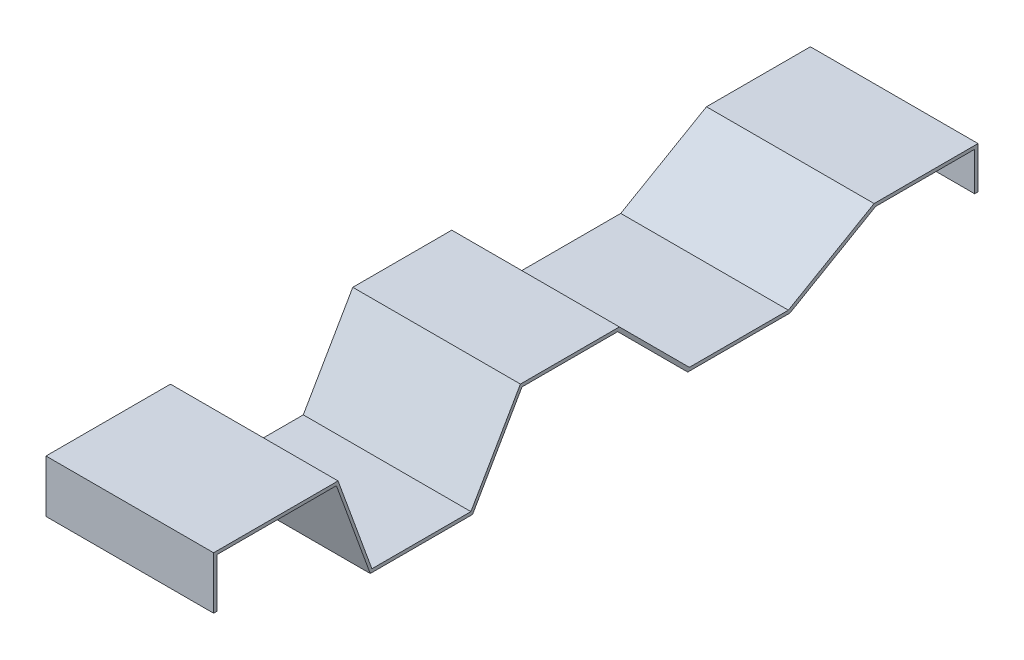
ISO-10303-21;
HEADER;
FILE_DESCRIPTION(('STEP AP214'),'2;1');
FILE_NAME('part.step','',(''),(''),'','','');
FILE_SCHEMA(('AUTOMOTIVE_DESIGN { 1 0 10303 214 1 1 1 1 }'));
ENDSEC;
DATA;
#1=APPLICATION_CONTEXT('core data for automotive mechanical design processes');
#2=APPLICATION_PROTOCOL_DEFINITION('international standard','automotive_design',2000,#1);
#3=PRODUCT_CONTEXT('',#1,'mechanical');
#4=PRODUCT('Part','Part','',(#3));
#5=PRODUCT_RELATED_PRODUCT_CATEGORY('part','',(#4));
#6=PRODUCT_DEFINITION_FORMATION('','',#4);
#7=PRODUCT_DEFINITION_CONTEXT('part definition',#1,'design');
#8=PRODUCT_DEFINITION('design','',#6,#7);
#9=PRODUCT_DEFINITION_SHAPE('','',#8);
#10=(LENGTH_UNIT() NAMED_UNIT(*) SI_UNIT(.MILLI.,.METRE.));
#11=(NAMED_UNIT(*) PLANE_ANGLE_UNIT() SI_UNIT($,.RADIAN.));
#12=(NAMED_UNIT(*) SI_UNIT($,.STERADIAN.) SOLID_ANGLE_UNIT());
#13=UNCERTAINTY_MEASURE_WITH_UNIT(LENGTH_MEASURE(1.E-05),#10,'distance_accuracy_value','');
#14=(GEOMETRIC_REPRESENTATION_CONTEXT(3) GLOBAL_UNCERTAINTY_ASSIGNED_CONTEXT((#13)) GLOBAL_UNIT_ASSIGNED_CONTEXT((#10,
#11,#12)) REPRESENTATION_CONTEXT('',''));
#15=CARTESIAN_POINT('',(0.,0.,0.));
#16=DIRECTION('',(0.,0.,1.));
#17=DIRECTION('',(1.,0.,0.));
#18=AXIS2_PLACEMENT_3D('',#15,#16,#17);
#19=CARTESIAN_POINT('',(101.6,-727.73801642509,-410.975974775369));
#20=DIRECTION('',(0.,1.,0.));
#21=DIRECTION('',(0.,0.,1.));
#22=AXIS2_PLACEMENT_3D('',#19,#20,#21);
#23=PLANE('',#22);
#24=DIRECTION('',(0.,0.,-1.));
#25=VECTOR('',#24,1.);
#26=CARTESIAN_POINT('',(0.,-727.73801642509,-410.975974775369));
#27=LINE('',#26,#25);
#28=CARTESIAN_POINT('',(0.,-727.73801642509,-408.975974775369));
#29=VERTEX_POINT('',#28);
#30=CARTESIAN_POINT('',(0.,-727.73801642509,-410.975974775369));
#31=VERTEX_POINT('',#30);
#32=EDGE_CURVE('E226',#29,#31,#27,.T.);
#33=ORIENTED_EDGE('',*,*,#32,.T.);
#34=DIRECTION('',(-1.,0.,0.));
#35=VECTOR('',#34,1.);
#36=CARTESIAN_POINT('',(101.6,-727.73801642509,-410.975974775369));
#37=LINE('',#36,#35);
#38=CARTESIAN_POINT('',(101.6,-727.73801642509,-410.975974775369));
#39=VERTEX_POINT('',#38);
#40=EDGE_CURVE('E11',#39,#31,#37,.T.);
#41=ORIENTED_EDGE('',*,*,#40,.F.);
#42=DIRECTION('',(0.,0.,-1.));
#43=VECTOR('',#42,1.);
#44=CARTESIAN_POINT('',(101.6,-727.73801642509,-410.975974775369));
#45=LINE('',#44,#43);
#46=CARTESIAN_POINT('',(101.6,-727.73801642509,-408.975974775369));
#47=VERTEX_POINT('',#46);
#48=EDGE_CURVE('E272',#47,#39,#45,.T.);
#49=ORIENTED_EDGE('',*,*,#48,.F.);
#50=DIRECTION('',(-1.,0.,0.));
#51=VECTOR('',#50,1.);
#52=CARTESIAN_POINT('',(101.6,-727.73801642509,-408.975974775369));
#53=LINE('',#52,#51);
#54=EDGE_CURVE('E222',#47,#29,#53,.T.);
#55=ORIENTED_EDGE('',*,*,#54,.T.);
#56=EDGE_LOOP('',(#33,#41,#49,#55));
#57=FACE_BOUND('',#56,.T.);
#58=ADVANCED_FACE('F34',(#57),#23,.F.);
#59=CARTESIAN_POINT('',(101.6,-727.73801642509,-410.975974775369));
#60=DIRECTION('',(0.,0.,1.));
#61=DIRECTION('',(0.,-1.,0.));
#62=AXIS2_PLACEMENT_3D('',#59,#60,#61);
#63=PLANE('',#62);
#64=DIRECTION('',(0.,1.,0.));
#65=VECTOR('',#64,1.);
#66=CARTESIAN_POINT('',(0.,-727.73801642509,-410.975974775369));
#67=LINE('',#66,#65);
#68=CARTESIAN_POINT('',(0.,-702.33801642509,-410.975974775369));
#69=VERTEX_POINT('',#68);
#70=EDGE_CURVE('E229',#31,#69,#67,.T.);
#71=ORIENTED_EDGE('',*,*,#70,.T.);
#72=DIRECTION('',(-1.,0.,0.));
#73=VECTOR('',#72,1.);
#74=CARTESIAN_POINT('',(101.6,-702.33801642509,-410.975974775369));
#75=LINE('',#74,#73);
#76=CARTESIAN_POINT('',(101.6,-702.33801642509,-410.975974775369));
#77=VERTEX_POINT('',#76);
#78=EDGE_CURVE('E42',#77,#69,#75,.T.);
#79=ORIENTED_EDGE('',*,*,#78,.F.);
#80=DIRECTION('',(0.,1.,0.));
#81=VECTOR('',#80,1.);
#82=CARTESIAN_POINT('',(101.6,-727.73801642509,-410.975974775369));
#83=LINE('',#82,#81);
#84=EDGE_CURVE('E141',#39,#77,#83,.T.);
#85=ORIENTED_EDGE('',*,*,#84,.F.);
#86=ORIENTED_EDGE('',*,*,#40,.T.);
#87=EDGE_LOOP('',(#71,#79,#85,#86));
#88=FACE_BOUND('',#87,.T.);
#89=ADVANCED_FACE('F410',(#88),#63,.F.);
#90=CARTESIAN_POINT('',(101.6,-702.33801642509,-410.975974775369));
#91=DIRECTION('',(0.,-1.,0.));
#92=DIRECTION('',(0.,0.,-1.));
#93=AXIS2_PLACEMENT_3D('',#90,#91,#92);
#94=PLANE('',#93);
#95=DIRECTION('',(0.,0.,1.));
#96=VECTOR('',#95,1.);
#97=CARTESIAN_POINT('',(0.,-702.33801642509,-410.975974775369));
#98=LINE('',#97,#96);
#99=CARTESIAN_POINT('',(0.,-702.33801642509,-347.983974775369));
#100=VERTEX_POINT('',#99);
#101=EDGE_CURVE('E231',#69,#100,#98,.T.);
#102=ORIENTED_EDGE('',*,*,#101,.T.);
#103=DIRECTION('',(-1.,0.,0.));
#104=VECTOR('',#103,1.);
#105=CARTESIAN_POINT('',(101.6,-702.33801642509,-347.983974775369));
#106=LINE('',#105,#104);
#107=CARTESIAN_POINT('',(101.6,-702.33801642509,-347.983974775369));
#108=VERTEX_POINT('',#107);
#109=EDGE_CURVE('E327',#108,#100,#106,.T.);
#110=ORIENTED_EDGE('',*,*,#109,.F.);
#111=DIRECTION('',(0.,0.,1.));
#112=VECTOR('',#111,1.);
#113=CARTESIAN_POINT('',(101.6,-702.33801642509,-410.975974775369));
#114=LINE('',#113,#112);
#115=EDGE_CURVE('E335',#77,#108,#114,.T.);
#116=ORIENTED_EDGE('',*,*,#115,.F.);
#117=ORIENTED_EDGE('',*,*,#78,.T.);
#118=EDGE_LOOP('',(#102,#110,#116,#117));
#119=FACE_BOUND('',#118,.T.);
#120=ADVANCED_FACE('F333',(#119),#94,.F.);
#121=CARTESIAN_POINT('',(101.6,-702.33801642509,-347.983974775369));
#122=DIRECTION('',(0.,-0.86602540378444,-0.499999999999997));
#123=DIRECTION('',(0.,0.499999999999997,-0.86602540378444));
#124=AXIS2_PLACEMENT_3D('',#121,#122,#123);
#125=PLANE('',#124);
#126=DIRECTION('',(0.,-0.499999999999997,0.86602540378444));
#127=VECTOR('',#126,1.);
#128=CARTESIAN_POINT('',(0.,-702.33801642509,-347.983974775369));
#129=LINE('',#128,#127);
#130=CARTESIAN_POINT('',(0.,-732.33801642509,-296.022450548302));
#131=VERTEX_POINT('',#130);
#132=EDGE_CURVE('E233',#100,#131,#129,.T.);
#133=ORIENTED_EDGE('',*,*,#132,.T.);
#134=DIRECTION('',(-1.,0.,0.));
#135=VECTOR('',#134,1.);
#136=CARTESIAN_POINT('',(101.6,-732.33801642509,-296.022450548302));
#137=LINE('',#136,#135);
#138=CARTESIAN_POINT('',(101.6,-732.33801642509,-296.022450548302));
#139=VERTEX_POINT('',#138);
#140=EDGE_CURVE('E324',#139,#131,#137,.T.);
#141=ORIENTED_EDGE('',*,*,#140,.F.);
#142=DIRECTION('',(0.,-0.499999999999997,0.86602540378444));
#143=VECTOR('',#142,1.);
#144=CARTESIAN_POINT('',(101.6,-702.33801642509,-347.983974775369));
#145=LINE('',#144,#143);
#146=EDGE_CURVE('E353',#108,#139,#145,.T.);
#147=ORIENTED_EDGE('',*,*,#146,.F.);
#148=ORIENTED_EDGE('',*,*,#109,.T.);
#149=EDGE_LOOP('',(#133,#141,#147,#148));
#150=FACE_BOUND('',#149,.T.);
#151=ADVANCED_FACE('F344',(#150),#125,.F.);
#152=CARTESIAN_POINT('',(101.6,-732.33801642509,-296.022450548302));
#153=DIRECTION('',(0.,-1.,0.));
#154=DIRECTION('',(0.,0.,-1.));
#155=AXIS2_PLACEMENT_3D('',#152,#153,#154);
#156=PLANE('',#155);
#157=DIRECTION('',(0.,0.,1.));
#158=VECTOR('',#157,1.);
#159=CARTESIAN_POINT('',(0.,-732.33801642509,-296.022450548302));
#160=LINE('',#159,#158);
#161=CARTESIAN_POINT('',(0.,-732.33801642509,-236.022450548302));
#162=VERTEX_POINT('',#161);
#163=EDGE_CURVE('E235',#131,#162,#160,.T.);
#164=ORIENTED_EDGE('',*,*,#163,.T.);
#165=DIRECTION('',(-1.,0.,0.));
#166=VECTOR('',#165,1.);
#167=CARTESIAN_POINT('',(101.6,-732.33801642509,-236.022450548302));
#168=LINE('',#167,#166);
#169=CARTESIAN_POINT('',(101.6,-732.33801642509,-236.022450548302));
#170=VERTEX_POINT('',#169);
#171=EDGE_CURVE('E321',#170,#162,#168,.T.);
#172=ORIENTED_EDGE('',*,*,#171,.F.);
#173=DIRECTION('',(0.,0.,1.));
#174=VECTOR('',#173,1.);
#175=CARTESIAN_POINT('',(101.6,-732.33801642509,-296.022450548302));
#176=LINE('',#175,#174);
#177=EDGE_CURVE('E350',#139,#170,#176,.T.);
#178=ORIENTED_EDGE('',*,*,#177,.F.);
#179=ORIENTED_EDGE('',*,*,#140,.T.);
#180=EDGE_LOOP('',(#164,#172,#178,#179));
#181=FACE_BOUND('',#180,.T.);
#182=ADVANCED_FACE('F348',(#181),#156,.F.);
#183=CARTESIAN_POINT('',(101.6,-732.33801642509,-236.022450548302));
#184=DIRECTION('',(0.,-0.707106781186546,0.707106781186549));
#185=DIRECTION('',(0.,-0.707106781186549,-0.707106781186546));
#186=AXIS2_PLACEMENT_3D('',#183,#184,#185);
#187=PLANE('',#186);
#188=DIRECTION('',(0.,0.707106781186549,0.707106781186546));
#189=VECTOR('',#188,1.);
#190=CARTESIAN_POINT('',(0.,-732.33801642509,-236.022450548302));
#191=LINE('',#190,#189);
#192=CARTESIAN_POINT('',(0.,-689.911609553897,-193.59604367711));
#193=VERTEX_POINT('',#192);
#194=EDGE_CURVE('E237',#162,#193,#191,.T.);
#195=ORIENTED_EDGE('',*,*,#194,.T.);
#196=DIRECTION('',(-1.,0.,0.));
#197=VECTOR('',#196,1.);
#198=CARTESIAN_POINT('',(101.6,-689.911609553897,-193.59604367711));
#199=LINE('',#198,#197);
#200=CARTESIAN_POINT('',(101.6,-689.911609553897,-193.59604367711));
#201=VERTEX_POINT('',#200);
#202=EDGE_CURVE('E318',#201,#193,#199,.T.);
#203=ORIENTED_EDGE('',*,*,#202,.F.);
#204=DIRECTION('',(0.,0.707106781186549,0.707106781186546));
#205=VECTOR('',#204,1.);
#206=CARTESIAN_POINT('',(101.6,-732.33801642509,-236.022450548302));
#207=LINE('',#206,#205);
#208=EDGE_CURVE('E352',#170,#201,#207,.T.);
#209=ORIENTED_EDGE('',*,*,#208,.F.);
#210=ORIENTED_EDGE('',*,*,#171,.T.);
#211=EDGE_LOOP('',(#195,#203,#209,#210));
#212=FACE_BOUND('',#211,.T.);
#213=ADVANCED_FACE('F423',(#212),#187,.F.);
#214=CARTESIAN_POINT('',(101.6,-689.911609553897,-193.59604367711));
#215=DIRECTION('',(0.,-1.,0.));
#216=DIRECTION('',(0.,0.,-1.));
#217=AXIS2_PLACEMENT_3D('',#214,#215,#216);
#218=PLANE('',#217);
#219=DIRECTION('',(0.,0.,1.));
#220=VECTOR('',#219,1.);
#221=CARTESIAN_POINT('',(0.,-689.911609553897,-193.59604367711));
#222=LINE('',#221,#220);
#223=CARTESIAN_POINT('',(0.,-689.911609553897,-133.59604367711));
#224=VERTEX_POINT('',#223);
#225=EDGE_CURVE('E239',#193,#224,#222,.T.);
#226=ORIENTED_EDGE('',*,*,#225,.T.);
#227=DIRECTION('',(-1.,0.,0.));
#228=VECTOR('',#227,1.);
#229=CARTESIAN_POINT('',(101.6,-689.911609553897,-133.59604367711));
#230=LINE('',#229,#228);
#231=CARTESIAN_POINT('',(101.6,-689.911609553897,-133.59604367711));
#232=VERTEX_POINT('',#231);
#233=EDGE_CURVE('E315',#232,#224,#230,.T.);
#234=ORIENTED_EDGE('',*,*,#233,.F.);
#235=DIRECTION('',(0.,0.,1.));
#236=VECTOR('',#235,1.);
#237=CARTESIAN_POINT('',(101.6,-689.911609553897,-193.59604367711));
#238=LINE('',#237,#236);
#239=EDGE_CURVE('E355',#201,#232,#238,.T.);
#240=ORIENTED_EDGE('',*,*,#239,.F.);
#241=ORIENTED_EDGE('',*,*,#202,.T.);
#242=EDGE_LOOP('',(#226,#234,#240,#241));
#243=FACE_BOUND('',#242,.T.);
#244=ADVANCED_FACE('F426',(#243),#218,.F.);
#245=CARTESIAN_POINT('',(101.6,-689.911609553897,-133.59604367711));
#246=DIRECTION('',(0.,-0.499999999999994,-0.866025403784442));
#247=DIRECTION('',(0.,0.866025403784442,-0.499999999999994));
#248=AXIS2_PLACEMENT_3D('',#245,#246,#247);
#249=PLANE('',#248);
#250=DIRECTION('',(0.,-0.866025403784442,0.499999999999994));
#251=VECTOR('',#250,1.);
#252=CARTESIAN_POINT('',(0.,-689.911609553897,-133.59604367711));
#253=LINE('',#252,#251);
#254=CARTESIAN_POINT('',(0.,-741.873133780964,-103.59604367711));
#255=VERTEX_POINT('',#254);
#256=EDGE_CURVE('E241',#224,#255,#253,.T.);
#257=ORIENTED_EDGE('',*,*,#256,.T.);
#258=DIRECTION('',(-1.,0.,0.));
#259=VECTOR('',#258,1.);
#260=CARTESIAN_POINT('',(101.6,-741.873133780964,-103.59604367711));
#261=LINE('',#260,#259);
#262=CARTESIAN_POINT('',(101.6,-741.873133780964,-103.59604367711));
#263=VERTEX_POINT('',#262);
#264=EDGE_CURVE('E312',#263,#255,#261,.T.);
#265=ORIENTED_EDGE('',*,*,#264,.F.);
#266=DIRECTION('',(0.,-0.866025403784442,0.499999999999994));
#267=VECTOR('',#266,1.);
#268=CARTESIAN_POINT('',(101.6,-689.911609553897,-133.59604367711));
#269=LINE('',#268,#267);
#270=EDGE_CURVE('E361',#232,#263,#269,.T.);
#271=ORIENTED_EDGE('',*,*,#270,.F.);
#272=ORIENTED_EDGE('',*,*,#233,.T.);
#273=EDGE_LOOP('',(#257,#265,#271,#272));
#274=FACE_BOUND('',#273,.T.);
#275=ADVANCED_FACE('F430',(#274),#249,.F.);
#276=CARTESIAN_POINT('',(101.6,-741.873133780964,-103.59604367711));
#277=DIRECTION('',(0.,-1.,0.));
#278=DIRECTION('',(0.,0.,-1.));
#279=AXIS2_PLACEMENT_3D('',#276,#277,#278);
#280=PLANE('',#279);
#281=DIRECTION('',(0.,0.,1.));
#282=VECTOR('',#281,1.);
#283=CARTESIAN_POINT('',(0.,-741.873133780964,-103.59604367711));
#284=LINE('',#283,#282);
#285=CARTESIAN_POINT('',(0.,-741.873133780964,-43.5960436771099));
#286=VERTEX_POINT('',#285);
#287=EDGE_CURVE('E243',#255,#286,#284,.T.);
#288=ORIENTED_EDGE('',*,*,#287,.T.);
#289=DIRECTION('',(-1.,0.,0.));
#290=VECTOR('',#289,1.);
#291=CARTESIAN_POINT('',(101.6,-741.873133780964,-43.5960436771099));
#292=LINE('',#291,#290);
#293=CARTESIAN_POINT('',(101.6,-741.873133780964,-43.5960436771099));
#294=VERTEX_POINT('',#293);
#295=EDGE_CURVE('E309',#294,#286,#292,.T.);
#296=ORIENTED_EDGE('',*,*,#295,.F.);
#297=DIRECTION('',(0.,0.,1.));
#298=VECTOR('',#297,1.);
#299=CARTESIAN_POINT('',(101.6,-741.873133780964,-103.59604367711));
#300=LINE('',#299,#298);
#301=EDGE_CURVE('E363',#263,#294,#300,.T.);
#302=ORIENTED_EDGE('',*,*,#301,.F.);
#303=ORIENTED_EDGE('',*,*,#264,.T.);
#304=EDGE_LOOP('',(#288,#296,#302,#303));
#305=FACE_BOUND('',#304,.T.);
#306=ADVANCED_FACE('F434',(#305),#280,.F.);
#307=CARTESIAN_POINT('',(101.6,-741.873133780964,-43.5960436771099));
#308=DIRECTION('',(0.,-0.342020143325665,0.93969262078591));
#309=DIRECTION('',(0.,-0.93969262078591,-0.342020143325665));
#310=AXIS2_PLACEMENT_3D('',#307,#308,#309);
#311=PLANE('',#310);
#312=DIRECTION('',(0.,0.93969262078591,0.342020143325665));
#313=VECTOR('',#312,1.);
#314=CARTESIAN_POINT('',(0.,-741.873133780964,-43.5960436771099));
#315=LINE('',#314,#313);
#316=CARTESIAN_POINT('',(0.,-685.491576533809,-23.07483507757));
#317=VERTEX_POINT('',#316);
#318=EDGE_CURVE('E245',#286,#317,#315,.T.);
#319=ORIENTED_EDGE('',*,*,#318,.T.);
#320=DIRECTION('',(-1.,0.,0.));
#321=VECTOR('',#320,1.);
#322=CARTESIAN_POINT('',(101.6,-685.491576533809,-23.07483507757));
#323=LINE('',#322,#321);
#324=CARTESIAN_POINT('',(101.6,-685.491576533809,-23.07483507757));
#325=VERTEX_POINT('',#324);
#326=EDGE_CURVE('E306',#325,#317,#323,.T.);
#327=ORIENTED_EDGE('',*,*,#326,.F.);
#328=DIRECTION('',(0.,0.93969262078591,0.342020143325665));
#329=VECTOR('',#328,1.);
#330=CARTESIAN_POINT('',(101.6,-741.873133780964,-43.5960436771099));
#331=LINE('',#330,#329);
#332=EDGE_CURVE('E365',#294,#325,#331,.T.);
#333=ORIENTED_EDGE('',*,*,#332,.F.);
#334=ORIENTED_EDGE('',*,*,#295,.T.);
#335=EDGE_LOOP('',(#319,#327,#333,#334));
#336=FACE_BOUND('',#335,.T.);
#337=ADVANCED_FACE('F438',(#336),#311,.F.);
#338=CARTESIAN_POINT('',(101.6,-685.491576533809,-23.07483507757));
#339=DIRECTION('',(0.,-1.,0.));
#340=DIRECTION('',(0.,0.,-1.));
#341=AXIS2_PLACEMENT_3D('',#338,#339,#340);
#342=PLANE('',#341);
#343=DIRECTION('',(0.,0.,1.));
#344=VECTOR('',#343,1.);
#345=CARTESIAN_POINT('',(0.,-685.491576533809,-23.07483507757));
#346=LINE('',#345,#344);
#347=CARTESIAN_POINT('',(0.,-685.491576533809,52.36316492243));
#348=VERTEX_POINT('',#347);
#349=EDGE_CURVE('E247',#317,#348,#346,.T.);
#350=ORIENTED_EDGE('',*,*,#349,.T.);
#351=DIRECTION('',(-1.,0.,0.));
#352=VECTOR('',#351,1.);
#353=CARTESIAN_POINT('',(101.6,-685.491576533809,52.36316492243));
#354=LINE('',#353,#352);
#355=CARTESIAN_POINT('',(101.6,-685.491576533809,52.36316492243));
#356=VERTEX_POINT('',#355);
#357=EDGE_CURVE('E303',#356,#348,#354,.T.);
#358=ORIENTED_EDGE('',*,*,#357,.F.);
#359=DIRECTION('',(0.,0.,1.));
#360=VECTOR('',#359,1.);
#361=CARTESIAN_POINT('',(101.6,-685.491576533809,-23.07483507757));
#362=LINE('',#361,#360);
#363=EDGE_CURVE('E367',#325,#356,#362,.T.);
#364=ORIENTED_EDGE('',*,*,#363,.F.);
#365=ORIENTED_EDGE('',*,*,#326,.T.);
#366=EDGE_LOOP('',(#350,#358,#364,#365));
#367=FACE_BOUND('',#366,.T.);
#368=ADVANCED_FACE('F442',(#367),#342,.F.);
#369=CARTESIAN_POINT('',(101.6,-685.491576533809,52.36316492243));
#370=DIRECTION('',(0.,0.,-1.));
#371=DIRECTION('',(0.,1.,0.));
#372=AXIS2_PLACEMENT_3D('',#369,#370,#371);
#373=PLANE('',#372);
#374=DIRECTION('',(0.,-1.,0.));
#375=VECTOR('',#374,1.);
#376=CARTESIAN_POINT('',(0.,-685.491576533809,52.36316492243));
#377=LINE('',#376,#375);
#378=CARTESIAN_POINT('',(0.,-717.241576533809,52.36316492243));
#379=VERTEX_POINT('',#378);
#380=EDGE_CURVE('E249',#348,#379,#377,.T.);
#381=ORIENTED_EDGE('',*,*,#380,.T.);
#382=DIRECTION('',(-1.,0.,0.));
#383=VECTOR('',#382,1.);
#384=CARTESIAN_POINT('',(101.6,-717.241576533809,52.36316492243));
#385=LINE('',#384,#383);
#386=CARTESIAN_POINT('',(101.6,-717.241576533809,52.36316492243));
#387=VERTEX_POINT('',#386);
#388=EDGE_CURVE('E300',#387,#379,#385,.T.);
#389=ORIENTED_EDGE('',*,*,#388,.F.);
#390=DIRECTION('',(0.,-1.,0.));
#391=VECTOR('',#390,1.);
#392=CARTESIAN_POINT('',(101.6,-685.491576533809,52.36316492243));
#393=LINE('',#392,#391);
#394=EDGE_CURVE('E369',#356,#387,#393,.T.);
#395=ORIENTED_EDGE('',*,*,#394,.F.);
#396=ORIENTED_EDGE('',*,*,#357,.T.);
#397=EDGE_LOOP('',(#381,#389,#395,#396));
#398=FACE_BOUND('',#397,.T.);
#399=ADVANCED_FACE('F446',(#398),#373,.F.);
#400=CARTESIAN_POINT('',(101.6,-717.241576533809,50.36316492243));
#401=DIRECTION('',(0.,1.,0.));
#402=DIRECTION('',(0.,0.,1.));
#403=AXIS2_PLACEMENT_3D('',#400,#401,#402);
#404=PLANE('',#403);
#405=DIRECTION('',(0.,0.,-1.));
#406=VECTOR('',#405,1.);
#407=CARTESIAN_POINT('',(0.,-717.241576533809,50.36316492243));
#408=LINE('',#407,#406);
#409=CARTESIAN_POINT('',(0.,-717.241576533809,50.36316492243));
#410=VERTEX_POINT('',#409);
#411=EDGE_CURVE('E251',#379,#410,#408,.T.);
#412=ORIENTED_EDGE('',*,*,#411,.T.);
#413=DIRECTION('',(-1.,0.,0.));
#414=VECTOR('',#413,1.);
#415=CARTESIAN_POINT('',(101.6,-717.241576533809,50.36316492243));
#416=LINE('',#415,#414);
#417=CARTESIAN_POINT('',(101.6,-717.241576533809,50.36316492243));
#418=VERTEX_POINT('',#417);
#419=EDGE_CURVE('E297',#418,#410,#416,.T.);
#420=ORIENTED_EDGE('',*,*,#419,.F.);
#421=DIRECTION('',(0.,0.,-1.));
#422=VECTOR('',#421,1.);
#423=CARTESIAN_POINT('',(101.6,-717.241576533809,50.36316492243));
#424=LINE('',#423,#422);
#425=EDGE_CURVE('E371',#387,#418,#424,.T.);
#426=ORIENTED_EDGE('',*,*,#425,.F.);
#427=ORIENTED_EDGE('',*,*,#388,.T.);
#428=EDGE_LOOP('',(#412,#420,#426,#427));
#429=FACE_BOUND('',#428,.T.);
#430=ADVANCED_FACE('F450',(#429),#404,.F.);
#431=CARTESIAN_POINT('',(101.6,-687.491576533809,50.3631649224301));
#432=DIRECTION('',(0.,0.,1.));
#433=DIRECTION('',(0.,-1.,0.));
#434=AXIS2_PLACEMENT_3D('',#431,#432,#433);
#435=PLANE('',#434);
#436=DIRECTION('',(0.,1.,0.));
#437=VECTOR('',#436,1.);
#438=CARTESIAN_POINT('',(0.,-687.491576533809,50.3631649224301));
#439=LINE('',#438,#437);
#440=CARTESIAN_POINT('',(0.,-687.491576533809,50.3631649224301));
#441=VERTEX_POINT('',#440);
#442=EDGE_CURVE('E253',#410,#441,#439,.T.);
#443=ORIENTED_EDGE('',*,*,#442,.T.);
#444=DIRECTION('',(-1.,0.,0.));
#445=VECTOR('',#444,1.);
#446=CARTESIAN_POINT('',(101.6,-687.491576533809,50.3631649224301));
#447=LINE('',#446,#445);
#448=CARTESIAN_POINT('',(101.6,-687.491576533809,50.3631649224301));
#449=VERTEX_POINT('',#448);
#450=EDGE_CURVE('E294',#449,#441,#447,.T.);
#451=ORIENTED_EDGE('',*,*,#450,.F.);
#452=DIRECTION('',(0.,1.,0.));
#453=VECTOR('',#452,1.);
#454=CARTESIAN_POINT('',(101.6,-687.491576533809,50.3631649224301));
#455=LINE('',#454,#453);
#456=EDGE_CURVE('E373',#418,#449,#455,.T.);
#457=ORIENTED_EDGE('',*,*,#456,.F.);
#458=ORIENTED_EDGE('',*,*,#419,.T.);
#459=EDGE_LOOP('',(#443,#451,#457,#458));
#460=FACE_BOUND('',#459,.T.);
#461=ADVANCED_FACE('F454',(#460),#435,.F.);
#462=CARTESIAN_POINT('',(101.6,-687.491576533809,-22.0668350775703));
#463=DIRECTION('',(0.,1.,0.));
#464=DIRECTION('',(0.,0.,1.));
#465=AXIS2_PLACEMENT_3D('',#462,#463,#464);
#466=PLANE('',#465);
#467=DIRECTION('',(0.,0.,-1.));
#468=VECTOR('',#467,1.);
#469=CARTESIAN_POINT('',(0.,-687.491576533809,-22.0668350775703));
#470=LINE('',#469,#468);
#471=CARTESIAN_POINT('',(0.,-687.491576533809,-22.0668350775703));
#472=VERTEX_POINT('',#471);
#473=EDGE_CURVE('E255',#441,#472,#470,.T.);
#474=ORIENTED_EDGE('',*,*,#473,.T.);
#475=DIRECTION('',(-1.,0.,0.));
#476=VECTOR('',#475,1.);
#477=CARTESIAN_POINT('',(101.6,-687.491576533809,-22.0668350775703));
#478=LINE('',#477,#476);
#479=CARTESIAN_POINT('',(101.6,-687.491576533809,-22.0668350775703));
#480=VERTEX_POINT('',#479);
#481=EDGE_CURVE('E291',#480,#472,#478,.T.);
#482=ORIENTED_EDGE('',*,*,#481,.F.);
#483=DIRECTION('',(0.,0.,-1.));
#484=VECTOR('',#483,1.);
#485=CARTESIAN_POINT('',(101.6,-687.491576533809,-22.0668350775703));
#486=LINE('',#485,#484);
#487=EDGE_CURVE('E375',#449,#480,#486,.T.);
#488=ORIENTED_EDGE('',*,*,#487,.F.);
#489=ORIENTED_EDGE('',*,*,#450,.T.);
#490=EDGE_LOOP('',(#474,#482,#488,#489));
#491=FACE_BOUND('',#490,.T.);
#492=ADVANCED_FACE('F458',(#491),#466,.F.);
#493=CARTESIAN_POINT('',(101.6,-743.873133780964,-42.5880436771102));
#494=DIRECTION('',(0.,0.342020143325667,-0.939692620785909));
#495=DIRECTION('',(0.,0.939692620785909,0.342020143325667));
#496=AXIS2_PLACEMENT_3D('',#493,#494,#495);
#497=PLANE('',#496);
#498=DIRECTION('',(0.,-0.939692620785909,-0.342020143325667));
#499=VECTOR('',#498,1.);
#500=CARTESIAN_POINT('',(0.,-743.873133780964,-42.5880436771102));
#501=LINE('',#500,#499);
#502=CARTESIAN_POINT('',(0.,-743.873133780964,-42.5880436771102));
#503=VERTEX_POINT('',#502);
#504=EDGE_CURVE('E257',#472,#503,#501,.T.);
#505=ORIENTED_EDGE('',*,*,#504,.T.);
#506=DIRECTION('',(-1.,0.,0.));
#507=VECTOR('',#506,1.);
#508=CARTESIAN_POINT('',(101.6,-743.873133780964,-42.5880436771102));
#509=LINE('',#508,#507);
#510=CARTESIAN_POINT('',(101.6,-743.873133780964,-42.5880436771102));
#511=VERTEX_POINT('',#510);
#512=EDGE_CURVE('E288',#511,#503,#509,.T.);
#513=ORIENTED_EDGE('',*,*,#512,.F.);
#514=DIRECTION('',(0.,-0.939692620785909,-0.342020143325667));
#515=VECTOR('',#514,1.);
#516=CARTESIAN_POINT('',(101.6,-743.873133780964,-42.5880436771102));
#517=LINE('',#516,#515);
#518=EDGE_CURVE('E377',#480,#511,#517,.T.);
#519=ORIENTED_EDGE('',*,*,#518,.F.);
#520=ORIENTED_EDGE('',*,*,#481,.T.);
#521=EDGE_LOOP('',(#505,#513,#519,#520));
#522=FACE_BOUND('',#521,.T.);
#523=ADVANCED_FACE('F462',(#522),#497,.F.);
#524=CARTESIAN_POINT('',(101.6,-743.873133780964,-104.58804367711));
#525=DIRECTION('',(0.,1.,0.));
#526=DIRECTION('',(0.,0.,1.));
#527=AXIS2_PLACEMENT_3D('',#524,#525,#526);
#528=PLANE('',#527);
#529=DIRECTION('',(0.,0.,-1.));
#530=VECTOR('',#529,1.);
#531=CARTESIAN_POINT('',(0.,-743.873133780964,-104.58804367711));
#532=LINE('',#531,#530);
#533=CARTESIAN_POINT('',(0.,-743.873133780964,-104.58804367711));
#534=VERTEX_POINT('',#533);
#535=EDGE_CURVE('E259',#503,#534,#532,.T.);
#536=ORIENTED_EDGE('',*,*,#535,.T.);
#537=DIRECTION('',(-1.,0.,0.));
#538=VECTOR('',#537,1.);
#539=CARTESIAN_POINT('',(101.6,-743.873133780964,-104.58804367711));
#540=LINE('',#539,#538);
#541=CARTESIAN_POINT('',(101.6,-743.873133780964,-104.58804367711));
#542=VERTEX_POINT('',#541);
#543=EDGE_CURVE('E285',#542,#534,#540,.T.);
#544=ORIENTED_EDGE('',*,*,#543,.F.);
#545=DIRECTION('',(0.,0.,-1.));
#546=VECTOR('',#545,1.);
#547=CARTESIAN_POINT('',(101.6,-743.873133780964,-104.58804367711));
#548=LINE('',#547,#546);
#549=EDGE_CURVE('E379',#511,#542,#548,.T.);
#550=ORIENTED_EDGE('',*,*,#549,.F.);
#551=ORIENTED_EDGE('',*,*,#512,.T.);
#552=EDGE_LOOP('',(#536,#544,#550,#551));
#553=FACE_BOUND('',#552,.T.);
#554=ADVANCED_FACE('F466',(#553),#528,.F.);
#555=CARTESIAN_POINT('',(101.6,-691.911609553897,-134.58804367711));
#556=DIRECTION('',(0.,0.499999999999998,0.86602540378444));
#557=DIRECTION('',(0.,-0.86602540378444,0.499999999999998));
#558=AXIS2_PLACEMENT_3D('',#555,#556,#557);
#559=PLANE('',#558);
#560=DIRECTION('',(0.,0.86602540378444,-0.499999999999998));
#561=VECTOR('',#560,1.);
#562=CARTESIAN_POINT('',(0.,-691.911609553897,-134.58804367711));
#563=LINE('',#562,#561);
#564=CARTESIAN_POINT('',(0.,-691.911609553897,-134.58804367711));
#565=VERTEX_POINT('',#564);
#566=EDGE_CURVE('E261',#534,#565,#563,.T.);
#567=ORIENTED_EDGE('',*,*,#566,.T.);
#568=DIRECTION('',(-1.,0.,0.));
#569=VECTOR('',#568,1.);
#570=CARTESIAN_POINT('',(101.6,-691.911609553897,-134.58804367711));
#571=LINE('',#570,#569);
#572=CARTESIAN_POINT('',(101.6,-691.911609553897,-134.58804367711));
#573=VERTEX_POINT('',#572);
#574=EDGE_CURVE('E282',#573,#565,#571,.T.);
#575=ORIENTED_EDGE('',*,*,#574,.F.);
#576=DIRECTION('',(0.,0.86602540378444,-0.499999999999998));
#577=VECTOR('',#576,1.);
#578=CARTESIAN_POINT('',(101.6,-691.911609553897,-134.58804367711));
#579=LINE('',#578,#577);
#580=EDGE_CURVE('E381',#542,#573,#579,.T.);
#581=ORIENTED_EDGE('',*,*,#580,.F.);
#582=ORIENTED_EDGE('',*,*,#543,.T.);
#583=EDGE_LOOP('',(#567,#575,#581,#582));
#584=FACE_BOUND('',#583,.T.);
#585=ADVANCED_FACE('F470',(#584),#559,.F.);
#586=CARTESIAN_POINT('',(101.6,-691.911609553897,-192.58804367711));
#587=DIRECTION('',(0.,1.,0.));
#588=DIRECTION('',(0.,0.,1.));
#589=AXIS2_PLACEMENT_3D('',#586,#587,#588);
#590=PLANE('',#589);
#591=DIRECTION('',(0.,0.,-1.));
#592=VECTOR('',#591,1.);
#593=CARTESIAN_POINT('',(0.,-691.911609553897,-192.58804367711));
#594=LINE('',#593,#592);
#595=CARTESIAN_POINT('',(0.,-691.911609553897,-192.58804367711));
#596=VERTEX_POINT('',#595);
#597=EDGE_CURVE('E263',#565,#596,#594,.T.);
#598=ORIENTED_EDGE('',*,*,#597,.T.);
#599=DIRECTION('',(-1.,0.,0.));
#600=VECTOR('',#599,1.);
#601=CARTESIAN_POINT('',(101.6,-691.911609553897,-192.58804367711));
#602=LINE('',#601,#600);
#603=CARTESIAN_POINT('',(101.6,-691.911609553897,-192.58804367711));
#604=VERTEX_POINT('',#603);
#605=EDGE_CURVE('E279',#604,#596,#602,.T.);
#606=ORIENTED_EDGE('',*,*,#605,.F.);
#607=DIRECTION('',(0.,0.,-1.));
#608=VECTOR('',#607,1.);
#609=CARTESIAN_POINT('',(101.6,-691.911609553897,-192.58804367711));
#610=LINE('',#609,#608);
#611=EDGE_CURVE('E383',#573,#604,#610,.T.);
#612=ORIENTED_EDGE('',*,*,#611,.F.);
#613=ORIENTED_EDGE('',*,*,#574,.T.);
#614=EDGE_LOOP('',(#598,#606,#612,#613));
#615=FACE_BOUND('',#614,.T.);
#616=ADVANCED_FACE('F474',(#615),#590,.F.);
#617=CARTESIAN_POINT('',(101.6,-734.33801642509,-235.014450548303));
#618=DIRECTION('',(0.,0.707106781186545,-0.70710678118655));
#619=DIRECTION('',(0.,0.70710678118655,0.707106781186545));
#620=AXIS2_PLACEMENT_3D('',#617,#618,#619);
#621=PLANE('',#620);
#622=DIRECTION('',(0.,-0.70710678118655,-0.707106781186545));
#623=VECTOR('',#622,1.);
#624=CARTESIAN_POINT('',(0.,-734.33801642509,-235.014450548303));
#625=LINE('',#624,#623);
#626=CARTESIAN_POINT('',(0.,-734.33801642509,-235.014450548303));
#627=VERTEX_POINT('',#626);
#628=EDGE_CURVE('E265',#596,#627,#625,.T.);
#629=ORIENTED_EDGE('',*,*,#628,.T.);
#630=DIRECTION('',(-1.,0.,0.));
#631=VECTOR('',#630,1.);
#632=CARTESIAN_POINT('',(101.6,-734.33801642509,-235.014450548303));
#633=LINE('',#632,#631);
#634=CARTESIAN_POINT('',(101.6,-734.33801642509,-235.014450548303));
#635=VERTEX_POINT('',#634);
#636=EDGE_CURVE('E276',#635,#627,#633,.T.);
#637=ORIENTED_EDGE('',*,*,#636,.F.);
#638=DIRECTION('',(0.,-0.70710678118655,-0.707106781186545));
#639=VECTOR('',#638,1.);
#640=CARTESIAN_POINT('',(101.6,-734.33801642509,-235.014450548303));
#641=LINE('',#640,#639);
#642=EDGE_CURVE('E385',#604,#635,#641,.T.);
#643=ORIENTED_EDGE('',*,*,#642,.F.);
#644=ORIENTED_EDGE('',*,*,#605,.T.);
#645=EDGE_LOOP('',(#629,#637,#643,#644));
#646=FACE_BOUND('',#645,.T.);
#647=ADVANCED_FACE('F391',(#646),#621,.F.);
#648=CARTESIAN_POINT('',(101.6,-734.33801642509,-297.014450548303));
#649=DIRECTION('',(0.,1.,0.));
#650=DIRECTION('',(0.,0.,1.));
#651=AXIS2_PLACEMENT_3D('',#648,#649,#650);
#652=PLANE('',#651);
#653=DIRECTION('',(0.,0.,-1.));
#654=VECTOR('',#653,1.);
#655=CARTESIAN_POINT('',(0.,-734.33801642509,-297.014450548303));
#656=LINE('',#655,#654);
#657=CARTESIAN_POINT('',(0.,-734.33801642509,-297.014450548303));
#658=VERTEX_POINT('',#657);
#659=EDGE_CURVE('E267',#627,#658,#656,.T.);
#660=ORIENTED_EDGE('',*,*,#659,.T.);
#661=DIRECTION('',(-1.,0.,0.));
#662=VECTOR('',#661,1.);
#663=CARTESIAN_POINT('',(101.6,-734.33801642509,-297.014450548303));
#664=LINE('',#663,#662);
#665=CARTESIAN_POINT('',(101.6,-734.33801642509,-297.014450548303));
#666=VERTEX_POINT('',#665);
#667=EDGE_CURVE('E217',#666,#658,#664,.T.);
#668=ORIENTED_EDGE('',*,*,#667,.F.);
#669=DIRECTION('',(0.,0.,-1.));
#670=VECTOR('',#669,1.);
#671=CARTESIAN_POINT('',(101.6,-734.33801642509,-297.014450548303));
#672=LINE('',#671,#670);
#673=EDGE_CURVE('E208',#635,#666,#672,.T.);
#674=ORIENTED_EDGE('',*,*,#673,.F.);
#675=ORIENTED_EDGE('',*,*,#636,.T.);
#676=EDGE_LOOP('',(#660,#668,#674,#675));
#677=FACE_BOUND('',#676,.T.);
#678=ADVANCED_FACE('F395',(#677),#652,.F.);
#679=CARTESIAN_POINT('',(101.6,-704.33801642509,-348.975974775369));
#680=DIRECTION('',(0.,0.866025403784437,0.500000000000003));
#681=DIRECTION('',(0.,-0.500000000000003,0.866025403784437));
#682=AXIS2_PLACEMENT_3D('',#679,#680,#681);
#683=PLANE('',#682);
#684=DIRECTION('',(0.,0.500000000000003,-0.866025403784437));
#685=VECTOR('',#684,1.);
#686=CARTESIAN_POINT('',(0.,-704.33801642509,-348.975974775369));
#687=LINE('',#686,#685);
#688=CARTESIAN_POINT('',(0.,-704.33801642509,-348.975974775369));
#689=VERTEX_POINT('',#688);
#690=EDGE_CURVE('E216',#658,#689,#687,.T.);
#691=ORIENTED_EDGE('',*,*,#690,.T.);
#692=DIRECTION('',(-1.,0.,0.));
#693=VECTOR('',#692,1.);
#694=CARTESIAN_POINT('',(101.6,-704.33801642509,-348.975974775369));
#695=LINE('',#694,#693);
#696=CARTESIAN_POINT('',(101.6,-704.33801642509,-348.975974775369));
#697=VERTEX_POINT('',#696);
#698=EDGE_CURVE('E213',#697,#689,#695,.T.);
#699=ORIENTED_EDGE('',*,*,#698,.F.);
#700=DIRECTION('',(0.,0.500000000000003,-0.866025403784437));
#701=VECTOR('',#700,1.);
#702=CARTESIAN_POINT('',(101.6,-704.33801642509,-348.975974775369));
#703=LINE('',#702,#701);
#704=EDGE_CURVE('E202',#666,#697,#703,.T.);
#705=ORIENTED_EDGE('',*,*,#704,.F.);
#706=ORIENTED_EDGE('',*,*,#667,.T.);
#707=EDGE_LOOP('',(#691,#699,#705,#706));
#708=FACE_BOUND('',#707,.T.);
#709=ADVANCED_FACE('F214',(#708),#683,.F.);
#710=CARTESIAN_POINT('',(101.6,-704.33801642509,-408.975974775369));
#711=DIRECTION('',(0.,1.,0.));
#712=DIRECTION('',(0.,0.,1.));
#713=AXIS2_PLACEMENT_3D('',#710,#711,#712);
#714=PLANE('',#713);
#715=DIRECTION('',(0.,0.,-1.));
#716=VECTOR('',#715,1.);
#717=CARTESIAN_POINT('',(0.,-704.33801642509,-408.975974775369));
#718=LINE('',#717,#716);
#719=CARTESIAN_POINT('',(0.,-704.33801642509,-408.975974775369));
#720=VERTEX_POINT('',#719);
#721=EDGE_CURVE('E127',#689,#720,#718,.T.);
#722=ORIENTED_EDGE('',*,*,#721,.T.);
#723=DIRECTION('',(-1.,0.,0.));
#724=VECTOR('',#723,1.);
#725=CARTESIAN_POINT('',(101.6,-704.33801642509,-408.975974775369));
#726=LINE('',#725,#724);
#727=CARTESIAN_POINT('',(101.6,-704.33801642509,-408.975974775369));
#728=VERTEX_POINT('',#727);
#729=EDGE_CURVE('E218',#728,#720,#726,.T.);
#730=ORIENTED_EDGE('',*,*,#729,.F.);
#731=DIRECTION('',(0.,0.,-1.));
#732=VECTOR('',#731,1.);
#733=CARTESIAN_POINT('',(101.6,-704.33801642509,-408.975974775369));
#734=LINE('',#733,#732);
#735=EDGE_CURVE('E206',#697,#728,#734,.T.);
#736=ORIENTED_EDGE('',*,*,#735,.F.);
#737=ORIENTED_EDGE('',*,*,#698,.T.);
#738=EDGE_LOOP('',(#722,#730,#736,#737));
#739=FACE_BOUND('',#738,.T.);
#740=ADVANCED_FACE('F220',(#739),#714,.F.);
#741=CARTESIAN_POINT('',(101.6,-727.73801642509,-408.975974775369));
#742=DIRECTION('',(0.,0.,-1.));
#743=DIRECTION('',(-1.,0.,0.));
#744=AXIS2_PLACEMENT_3D('',#741,#742,#743);
#745=PLANE('',#744);
#746=DIRECTION('',(0.,-1.,0.));
#747=VECTOR('',#746,1.);
#748=CARTESIAN_POINT('',(0.,-727.73801642509,-408.975974775369));
#749=LINE('',#748,#747);
#750=EDGE_CURVE('E133',#720,#29,#749,.T.);
#751=ORIENTED_EDGE('',*,*,#750,.T.);
#752=ORIENTED_EDGE('',*,*,#54,.F.);
#753=DIRECTION('',(0.,-1.,0.));
#754=VECTOR('',#753,1.);
#755=CARTESIAN_POINT('',(101.6,-727.73801642509,-408.975974775369));
#756=LINE('',#755,#754);
#757=EDGE_CURVE('E50',#728,#47,#756,.T.);
#758=ORIENTED_EDGE('',*,*,#757,.F.);
#759=ORIENTED_EDGE('',*,*,#729,.T.);
#760=EDGE_LOOP('',(#751,#752,#758,#759));
#761=FACE_BOUND('',#760,.T.);
#762=ADVANCED_FACE('F399',(#761),#745,.F.);
#763=CARTESIAN_POINT('',(101.6,0.,0.));
#764=DIRECTION('',(-1.,0.,0.));
#765=DIRECTION('',(0.,0.,1.));
#766=AXIS2_PLACEMENT_3D('',#763,#764,#765);
#767=PLANE('',#766);
#768=ORIENTED_EDGE('',*,*,#48,.T.);
#769=ORIENTED_EDGE('',*,*,#84,.T.);
#770=ORIENTED_EDGE('',*,*,#115,.T.);
#771=ORIENTED_EDGE('',*,*,#146,.T.);
#772=ORIENTED_EDGE('',*,*,#177,.T.);
#773=ORIENTED_EDGE('',*,*,#208,.T.);
#774=ORIENTED_EDGE('',*,*,#239,.T.);
#775=ORIENTED_EDGE('',*,*,#270,.T.);
#776=ORIENTED_EDGE('',*,*,#301,.T.);
#777=ORIENTED_EDGE('',*,*,#332,.T.);
#778=ORIENTED_EDGE('',*,*,#363,.T.);
#779=ORIENTED_EDGE('',*,*,#394,.T.);
#780=ORIENTED_EDGE('',*,*,#425,.T.);
#781=ORIENTED_EDGE('',*,*,#456,.T.);
#782=ORIENTED_EDGE('',*,*,#487,.T.);
#783=ORIENTED_EDGE('',*,*,#518,.T.);
#784=ORIENTED_EDGE('',*,*,#549,.T.);
#785=ORIENTED_EDGE('',*,*,#580,.T.);
#786=ORIENTED_EDGE('',*,*,#611,.T.);
#787=ORIENTED_EDGE('',*,*,#642,.T.);
#788=ORIENTED_EDGE('',*,*,#673,.T.);
#789=ORIENTED_EDGE('',*,*,#704,.T.);
#790=ORIENTED_EDGE('',*,*,#735,.T.);
#791=ORIENTED_EDGE('',*,*,#757,.T.);
#792=EDGE_LOOP('',(#768,#769,#770,#771,#772,#773,#774,#775,#776,#777,#778,#779,#780,#781,#782,
#783,#784,#785,#786,#787,#788,#789,#790,#791));
#793=FACE_BOUND('',#792,.T.);
#794=ADVANCED_FACE('F204',(#793),#767,.F.);
#795=CARTESIAN_POINT('',(0.,0.,0.));
#796=DIRECTION('',(-1.,0.,0.));
#797=DIRECTION('',(0.,0.,1.));
#798=AXIS2_PLACEMENT_3D('',#795,#796,#797);
#799=PLANE('',#798);
#800=ORIENTED_EDGE('',*,*,#32,.F.);
#801=ORIENTED_EDGE('',*,*,#750,.F.);
#802=ORIENTED_EDGE('',*,*,#721,.F.);
#803=ORIENTED_EDGE('',*,*,#690,.F.);
#804=ORIENTED_EDGE('',*,*,#659,.F.);
#805=ORIENTED_EDGE('',*,*,#628,.F.);
#806=ORIENTED_EDGE('',*,*,#597,.F.);
#807=ORIENTED_EDGE('',*,*,#566,.F.);
#808=ORIENTED_EDGE('',*,*,#535,.F.);
#809=ORIENTED_EDGE('',*,*,#504,.F.);
#810=ORIENTED_EDGE('',*,*,#473,.F.);
#811=ORIENTED_EDGE('',*,*,#442,.F.);
#812=ORIENTED_EDGE('',*,*,#411,.F.);
#813=ORIENTED_EDGE('',*,*,#380,.F.);
#814=ORIENTED_EDGE('',*,*,#349,.F.);
#815=ORIENTED_EDGE('',*,*,#318,.F.);
#816=ORIENTED_EDGE('',*,*,#287,.F.);
#817=ORIENTED_EDGE('',*,*,#256,.F.);
#818=ORIENTED_EDGE('',*,*,#225,.F.);
#819=ORIENTED_EDGE('',*,*,#194,.F.);
#820=ORIENTED_EDGE('',*,*,#163,.F.);
#821=ORIENTED_EDGE('',*,*,#132,.F.);
#822=ORIENTED_EDGE('',*,*,#101,.F.);
#823=ORIENTED_EDGE('',*,*,#70,.F.);
#824=EDGE_LOOP('',(#800,#801,#802,#803,#804,#805,#806,#807,#808,#809,#810,#811,#812,#813,#814,
#815,#816,#817,#818,#819,#820,#821,#822,#823));
#825=FACE_BOUND('',#824,.T.);
#826=ADVANCED_FACE('F339',(#825),#799,.T.);
#827=CLOSED_SHELL('',(#58,#89,#120,#151,#182,#213,#244,#275,#306,#337,#368,#399,#430,#461,#492,
#523,#554,#585,#616,#647,#678,#709,#740,#762,#794,#826));
#828=MANIFOLD_SOLID_BREP('B2',#827);
#829=ADVANCED_BREP_SHAPE_REPRESENTATION('',(#18,#828),#14);
#830=SHAPE_DEFINITION_REPRESENTATION(#9,#829);
ENDSEC;
END-ISO-10303-21;
